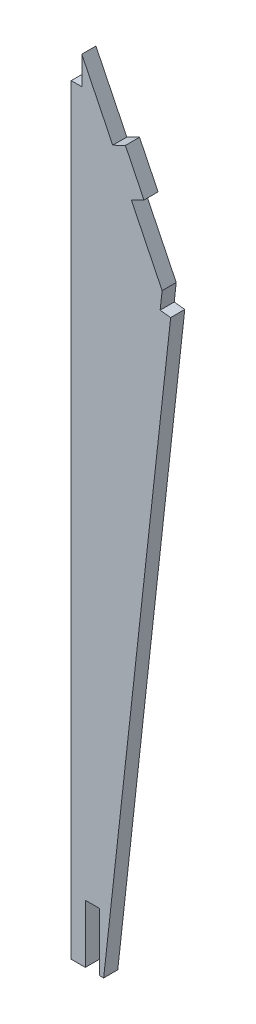
ISO-10303-21;
HEADER;
FILE_DESCRIPTION(('STEP AP214'),'2;1');
FILE_NAME('part.step','',(''),(''),'','','');
FILE_SCHEMA(('AUTOMOTIVE_DESIGN { 1 0 10303 214 1 1 1 1 }'));
ENDSEC;
DATA;
#1=APPLICATION_CONTEXT('core data for automotive mechanical design processes');
#2=APPLICATION_PROTOCOL_DEFINITION('international standard','automotive_design',2000,#1);
#3=PRODUCT_CONTEXT('',#1,'mechanical');
#4=PRODUCT('Part','Part','',(#3));
#5=PRODUCT_RELATED_PRODUCT_CATEGORY('part','',(#4));
#6=PRODUCT_DEFINITION_FORMATION('','',#4);
#7=PRODUCT_DEFINITION_CONTEXT('part definition',#1,'design');
#8=PRODUCT_DEFINITION('design','',#6,#7);
#9=PRODUCT_DEFINITION_SHAPE('','',#8);
#10=(LENGTH_UNIT() NAMED_UNIT(*) SI_UNIT(.MILLI.,.METRE.));
#11=(NAMED_UNIT(*) PLANE_ANGLE_UNIT() SI_UNIT($,.RADIAN.));
#12=(NAMED_UNIT(*) SI_UNIT($,.STERADIAN.) SOLID_ANGLE_UNIT());
#13=UNCERTAINTY_MEASURE_WITH_UNIT(LENGTH_MEASURE(1.E-05),#10,'distance_accuracy_value','');
#14=(GEOMETRIC_REPRESENTATION_CONTEXT(3) GLOBAL_UNCERTAINTY_ASSIGNED_CONTEXT((#13)) GLOBAL_UNIT_ASSIGNED_CONTEXT((#10,
#11,#12)) REPRESENTATION_CONTEXT('',''));
#15=CARTESIAN_POINT('',(0.,0.,0.));
#16=DIRECTION('',(0.,0.,1.));
#17=DIRECTION('',(1.,0.,0.));
#18=AXIS2_PLACEMENT_3D('',#15,#16,#17);
#19=CARTESIAN_POINT('',(10.822892068358,97.79495465443,2.));
#20=DIRECTION('',(0.10999766931796,0.993931845120487,0.));
#21=DIRECTION('',(-0.993931845120487,0.10999766931796,0.));
#22=AXIS2_PLACEMENT_3D('',#19,#20,#21);
#23=PLANE('',#22);
#24=DIRECTION('',(0.993931845120487,-0.10999766931796,0.));
#25=VECTOR('',#24,1.);
#26=CARTESIAN_POINT('',(10.822892068358,97.79495465443,0.));
#27=LINE('',#26,#25);
#28=CARTESIAN_POINT('',(26.0623496860735,96.1084156549523,0.));
#29=VERTEX_POINT('',#28);
#30=CARTESIAN_POINT('',(27.553247453754,95.9434191509754,0.));
#31=VERTEX_POINT('',#30);
#32=EDGE_CURVE('E178',#29,#31,#27,.T.);
#33=ORIENTED_EDGE('',*,*,#32,.F.);
#34=DIRECTION('',(0.,0.,-1.));
#35=VECTOR('',#34,1.);
#36=CARTESIAN_POINT('',(26.0623496860735,96.1084156549523,2.));
#37=LINE('',#36,#35);
#38=CARTESIAN_POINT('',(26.0623496860735,96.1084156549523,2.));
#39=VERTEX_POINT('',#38);
#40=EDGE_CURVE('E11',#39,#29,#37,.T.);
#41=ORIENTED_EDGE('',*,*,#40,.F.);
#42=DIRECTION('',(0.993931845120487,-0.10999766931796,0.));
#43=VECTOR('',#42,1.);
#44=CARTESIAN_POINT('',(10.822892068358,97.79495465443,2.));
#45=LINE('',#44,#43);
#46=CARTESIAN_POINT('',(27.553247453754,95.9434191509754,2.));
#47=VERTEX_POINT('',#46);
#48=EDGE_CURVE('E216',#39,#47,#45,.T.);
#49=ORIENTED_EDGE('',*,*,#48,.T.);
#50=DIRECTION('',(0.,0.,-1.));
#51=VECTOR('',#50,1.);
#52=CARTESIAN_POINT('',(27.553247453754,95.9434191509754,2.));
#53=LINE('',#52,#51);
#54=EDGE_CURVE('E53',#47,#31,#53,.T.);
#55=ORIENTED_EDGE('',*,*,#54,.T.);
#56=EDGE_LOOP('',(#33,#41,#49,#55));
#57=FACE_BOUND('',#56,.T.);
#58=ADVANCED_FACE('F37',(#57),#23,.T.);
#59=CARTESIAN_POINT('',(15.2394576177052,-1.68653899947817,2.));
#60=DIRECTION('',(0.993931845120476,-0.109997669318064,0.));
#61=DIRECTION('',(0.109997669318064,0.993931845120476,0.));
#62=AXIS2_PLACEMENT_3D('',#59,#60,#61);
#63=PLANE('',#62);
#64=DIRECTION('',(-0.109997669318064,-0.993931845120476,0.));
#65=VECTOR('',#64,1.);
#66=CARTESIAN_POINT('',(15.2394576177052,-1.68653899947817,0.));
#67=LINE('',#66,#65);
#68=CARTESIAN_POINT('',(26.3429738691066,98.6441176726103,0.));
#69=VERTEX_POINT('',#68);
#70=EDGE_CURVE('E180',#69,#29,#67,.T.);
#71=ORIENTED_EDGE('',*,*,#70,.F.);
#72=DIRECTION('',(0.,0.,-1.));
#73=VECTOR('',#72,1.);
#74=CARTESIAN_POINT('',(26.3429738691066,98.6441176726103,2.));
#75=LINE('',#74,#73);
#76=CARTESIAN_POINT('',(26.3429738691066,98.6441176726103,2.));
#77=VERTEX_POINT('',#76);
#78=EDGE_CURVE('E45',#77,#69,#75,.T.);
#79=ORIENTED_EDGE('',*,*,#78,.F.);
#80=DIRECTION('',(-0.109997669318064,-0.993931845120476,0.));
#81=VECTOR('',#80,1.);
#82=CARTESIAN_POINT('',(15.2394576177052,-1.68653899947817,2.));
#83=LINE('',#82,#81);
#84=EDGE_CURVE('E266',#77,#39,#83,.T.);
#85=ORIENTED_EDGE('',*,*,#84,.T.);
#86=ORIENTED_EDGE('',*,*,#40,.T.);
#87=EDGE_LOOP('',(#71,#79,#85,#86));
#88=FACE_BOUND('',#87,.T.);
#89=ADVANCED_FACE('F254',(#88),#63,.T.);
#90=CARTESIAN_POINT('',(60.1469767659438,29.3356406724625,2.));
#91=DIRECTION('',(0.898794046299179,0.438371146789053,0.));
#92=DIRECTION('',(-0.438371146789053,0.898794046299179,0.));
#93=AXIS2_PLACEMENT_3D('',#90,#91,#92);
#94=PLANE('',#93);
#95=DIRECTION('',(0.438371146789053,-0.898794046299179,0.));
#96=VECTOR('',#95,1.);
#97=CARTESIAN_POINT('',(60.1469767659438,29.3356406724625,0.));
#98=LINE('',#97,#96);
#99=CARTESIAN_POINT('',(21.972547422718,107.604819804981,0.));
#100=VERTEX_POINT('',#99);
#101=EDGE_CURVE('E183',#100,#69,#98,.T.);
#102=ORIENTED_EDGE('',*,*,#101,.F.);
#103=DIRECTION('',(0.,0.,-1.));
#104=VECTOR('',#103,1.);
#105=CARTESIAN_POINT('',(21.972547422718,107.604819804981,2.));
#106=LINE('',#105,#104);
#107=CARTESIAN_POINT('',(21.972547422718,107.604819804981,2.));
#108=VERTEX_POINT('',#107);
#109=EDGE_CURVE('E243',#108,#100,#106,.T.);
#110=ORIENTED_EDGE('',*,*,#109,.F.);
#111=DIRECTION('',(0.438371146789053,-0.898794046299179,0.));
#112=VECTOR('',#111,1.);
#113=CARTESIAN_POINT('',(60.1469767659438,29.3356406724625,2.));
#114=LINE('',#113,#112);
#115=EDGE_CURVE('E250',#108,#77,#114,.T.);
#116=ORIENTED_EDGE('',*,*,#115,.T.);
#117=ORIENTED_EDGE('',*,*,#78,.T.);
#118=EDGE_LOOP('',(#102,#110,#116,#117));
#119=FACE_BOUND('',#118,.T.);
#120=ADVANCED_FACE('F248',(#119),#94,.T.);
#121=CARTESIAN_POINT('',(-38.1744293432189,78.2691791325325,2.));
#122=DIRECTION('',(0.438371146788926,-0.898794046299241,0.));
#123=DIRECTION('',(0.898794046299241,0.438371146788927,0.));
#124=AXIS2_PLACEMENT_3D('',#121,#122,#123);
#125=PLANE('',#124);
#126=DIRECTION('',(-0.898794046299241,-0.438371146788927,0.));
#127=VECTOR('',#126,1.);
#128=CARTESIAN_POINT('',(-38.1744293432189,78.2691791325325,0.));
#129=LINE('',#128,#127);
#130=CARTESIAN_POINT('',(23.7701355153167,108.481562098559,0.));
#131=VERTEX_POINT('',#130);
#132=EDGE_CURVE('E186',#131,#100,#129,.T.);
#133=ORIENTED_EDGE('',*,*,#132,.F.);
#134=DIRECTION('',(0.,0.,-1.));
#135=VECTOR('',#134,1.);
#136=CARTESIAN_POINT('',(23.7701355153167,108.481562098559,2.));
#137=LINE('',#136,#135);
#138=CARTESIAN_POINT('',(23.7701355153167,108.481562098559,2.));
#139=VERTEX_POINT('',#138);
#140=EDGE_CURVE('E241',#139,#131,#137,.T.);
#141=ORIENTED_EDGE('',*,*,#140,.F.);
#142=DIRECTION('',(-0.898794046299241,-0.438371146788927,0.));
#143=VECTOR('',#142,1.);
#144=CARTESIAN_POINT('',(-38.1744293432189,78.2691791325325,2.));
#145=LINE('',#144,#143);
#146=EDGE_CURVE('E263',#139,#108,#145,.T.);
#147=ORIENTED_EDGE('',*,*,#146,.T.);
#148=ORIENTED_EDGE('',*,*,#109,.T.);
#149=EDGE_LOOP('',(#133,#141,#147,#148));
#150=FACE_BOUND('',#149,.T.);
#151=ADVANCED_FACE('F260',(#150),#125,.T.);
#152=CARTESIAN_POINT('',(61.9445648585684,30.2123829660949,2.));
#153=DIRECTION('',(0.898794046298942,0.438371146789539,0.));
#154=DIRECTION('',(-0.438371146789539,0.898794046298942,0.));
#155=AXIS2_PLACEMENT_3D('',#152,#153,#154);
#156=PLANE('',#155);
#157=DIRECTION('',(0.438371146789539,-0.898794046298942,0.));
#158=VECTOR('',#157,1.);
#159=CARTESIAN_POINT('',(61.9445648585684,30.2123829660949,0.));
#160=LINE('',#159,#158);
#161=CARTESIAN_POINT('',(21.1399086345791,113.874326376354,0.));
#162=VERTEX_POINT('',#161);
#163=EDGE_CURVE('E189',#162,#131,#160,.T.);
#164=ORIENTED_EDGE('',*,*,#163,.F.);
#165=DIRECTION('',(0.,0.,-1.));
#166=VECTOR('',#165,1.);
#167=CARTESIAN_POINT('',(21.1399086345791,113.874326376354,2.));
#168=LINE('',#167,#166);
#169=CARTESIAN_POINT('',(21.1399086345791,113.874326376354,2.));
#170=VERTEX_POINT('',#169);
#171=EDGE_CURVE('E239',#170,#162,#168,.T.);
#172=ORIENTED_EDGE('',*,*,#171,.F.);
#173=DIRECTION('',(0.438371146789539,-0.898794046298942,0.));
#174=VECTOR('',#173,1.);
#175=CARTESIAN_POINT('',(61.9445648585684,30.2123829660949,2.));
#176=LINE('',#175,#174);
#177=EDGE_CURVE('E268',#170,#139,#176,.T.);
#178=ORIENTED_EDGE('',*,*,#177,.T.);
#179=ORIENTED_EDGE('',*,*,#140,.T.);
#180=EDGE_LOOP('',(#164,#172,#178,#179));
#181=FACE_BOUND('',#180,.T.);
#182=ADVANCED_FACE('F320',(#181),#156,.T.);
#183=CARTESIAN_POINT('',(-40.8046562239632,83.6619434103089,2.));
#184=DIRECTION('',(-0.4383711467891,0.898794046299156,0.));
#185=DIRECTION('',(-0.898794046299156,-0.4383711467891,0.));
#186=AXIS2_PLACEMENT_3D('',#183,#184,#185);
#187=PLANE('',#186);
#188=DIRECTION('',(0.898794046299156,0.4383711467891,0.));
#189=VECTOR('',#188,1.);
#190=CARTESIAN_POINT('',(-40.8046562239632,83.6619434103089,0.));
#191=LINE('',#190,#189);
#192=CARTESIAN_POINT('',(19.3423205419831,112.997584082777,0.));
#193=VERTEX_POINT('',#192);
#194=EDGE_CURVE('E192',#193,#162,#191,.T.);
#195=ORIENTED_EDGE('',*,*,#194,.F.);
#196=DIRECTION('',(0.,0.,-1.));
#197=VECTOR('',#196,1.);
#198=CARTESIAN_POINT('',(19.3423205419831,112.997584082777,2.));
#199=LINE('',#198,#197);
#200=CARTESIAN_POINT('',(19.3423205419831,112.997584082777,2.));
#201=VERTEX_POINT('',#200);
#202=EDGE_CURVE('E237',#201,#193,#199,.T.);
#203=ORIENTED_EDGE('',*,*,#202,.F.);
#204=DIRECTION('',(0.898794046299156,0.4383711467891,0.));
#205=VECTOR('',#204,1.);
#206=CARTESIAN_POINT('',(-40.8046562239632,83.6619434103089,2.));
#207=LINE('',#206,#205);
#208=EDGE_CURVE('E274',#201,#170,#207,.T.);
#209=ORIENTED_EDGE('',*,*,#208,.T.);
#210=ORIENTED_EDGE('',*,*,#171,.T.);
#211=EDGE_LOOP('',(#195,#203,#209,#210));
#212=FACE_BOUND('',#211,.T.);
#213=ADVANCED_FACE('F323',(#212),#187,.T.);
#214=CARTESIAN_POINT('',(60.1469767659448,29.3356406724649,2.));
#215=DIRECTION('',(0.898794046299168,0.438371146789076,0.));
#216=DIRECTION('',(-0.438371146789076,0.898794046299168,0.));
#217=AXIS2_PLACEMENT_3D('',#214,#215,#216);
#218=PLANE('',#217);
#219=DIRECTION('',(0.438371146789076,-0.898794046299168,0.));
#220=VECTOR('',#219,1.);
#221=CARTESIAN_POINT('',(60.1469767659448,29.3356406724649,0.));
#222=LINE('',#221,#220);
#223=CARTESIAN_POINT('',(14.9586090740922,121.985524545768,0.));
#224=VERTEX_POINT('',#223);
#225=EDGE_CURVE('E195',#224,#193,#222,.T.);
#226=ORIENTED_EDGE('',*,*,#225,.F.);
#227=DIRECTION('',(0.,0.,-1.));
#228=VECTOR('',#227,1.);
#229=CARTESIAN_POINT('',(14.9586090740922,121.985524545768,2.));
#230=LINE('',#229,#228);
#231=CARTESIAN_POINT('',(14.9586090740922,121.985524545768,2.));
#232=VERTEX_POINT('',#231);
#233=EDGE_CURVE('E235',#232,#224,#230,.T.);
#234=ORIENTED_EDGE('',*,*,#233,.F.);
#235=DIRECTION('',(0.438371146789076,-0.898794046299168,0.));
#236=VECTOR('',#235,1.);
#237=CARTESIAN_POINT('',(60.1469767659448,29.3356406724649,2.));
#238=LINE('',#237,#236);
#239=EDGE_CURVE('E277',#232,#201,#238,.T.);
#240=ORIENTED_EDGE('',*,*,#239,.T.);
#241=ORIENTED_EDGE('',*,*,#202,.T.);
#242=EDGE_LOOP('',(#226,#234,#240,#241));
#243=FACE_BOUND('',#242,.T.);
#244=ADVANCED_FACE('F327',(#243),#218,.T.);
#245=CARTESIAN_POINT('',(14.9586090740922,0.,2.));
#246=DIRECTION('',(1.,0.,0.));
#247=DIRECTION('',(0.,0.,-1.));
#248=AXIS2_PLACEMENT_3D('',#245,#246,#247);
#249=PLANE('',#248);
#250=DIRECTION('',(0.,-1.,0.));
#251=VECTOR('',#250,1.);
#252=CARTESIAN_POINT('',(14.9586090740922,0.,0.));
#253=LINE('',#252,#251);
#254=CARTESIAN_POINT('',(14.9586090740922,117.985524545768,0.));
#255=VERTEX_POINT('',#254);
#256=EDGE_CURVE('E198',#224,#255,#253,.T.);
#257=ORIENTED_EDGE('',*,*,#256,.T.);
#258=DIRECTION('',(0.,0.,-1.));
#259=VECTOR('',#258,1.);
#260=CARTESIAN_POINT('',(14.9586090740922,117.985524545768,2.));
#261=LINE('',#260,#259);
#262=CARTESIAN_POINT('',(14.9586090740922,117.985524545768,2.));
#263=VERTEX_POINT('',#262);
#264=EDGE_CURVE('E232',#263,#255,#261,.T.);
#265=ORIENTED_EDGE('',*,*,#264,.F.);
#266=DIRECTION('',(0.,-1.,0.));
#267=VECTOR('',#266,1.);
#268=CARTESIAN_POINT('',(14.9586090740922,0.,2.));
#269=LINE('',#268,#267);
#270=EDGE_CURVE('E280',#232,#263,#269,.T.);
#271=ORIENTED_EDGE('',*,*,#270,.F.);
#272=ORIENTED_EDGE('',*,*,#233,.T.);
#273=EDGE_LOOP('',(#257,#265,#271,#272));
#274=FACE_BOUND('',#273,.T.);
#275=ADVANCED_FACE('F331',(#274),#249,.F.);
#276=CARTESIAN_POINT('',(0.,117.985524545768,2.));
#277=DIRECTION('',(0.,-1.,0.));
#278=DIRECTION('',(0.,0.,-1.));
#279=AXIS2_PLACEMENT_3D('',#276,#277,#278);
#280=PLANE('',#279);
#281=DIRECTION('',(-1.,0.,0.));
#282=VECTOR('',#281,1.);
#283=CARTESIAN_POINT('',(0.,117.985524545768,0.));
#284=LINE('',#283,#282);
#285=CARTESIAN_POINT('',(13.4586090740922,117.985524545768,0.));
#286=VERTEX_POINT('',#285);
#287=EDGE_CURVE('E200',#255,#286,#284,.T.);
#288=ORIENTED_EDGE('',*,*,#287,.T.);
#289=DIRECTION('',(0.,0.,-1.));
#290=VECTOR('',#289,1.);
#291=CARTESIAN_POINT('',(13.4586090740922,117.985524545768,2.));
#292=LINE('',#291,#290);
#293=CARTESIAN_POINT('',(13.4586090740922,117.985524545768,2.));
#294=VERTEX_POINT('',#293);
#295=EDGE_CURVE('E229',#294,#286,#292,.T.);
#296=ORIENTED_EDGE('',*,*,#295,.F.);
#297=DIRECTION('',(-1.,0.,0.));
#298=VECTOR('',#297,1.);
#299=CARTESIAN_POINT('',(0.,117.985524545768,2.));
#300=LINE('',#299,#298);
#301=EDGE_CURVE('E282',#263,#294,#300,.T.);
#302=ORIENTED_EDGE('',*,*,#301,.F.);
#303=ORIENTED_EDGE('',*,*,#264,.T.);
#304=EDGE_LOOP('',(#288,#296,#302,#303));
#305=FACE_BOUND('',#304,.T.);
#306=ADVANCED_FACE('F335',(#305),#280,.F.);
#307=CARTESIAN_POINT('',(13.4586090740922,0.,2.));
#308=DIRECTION('',(1.,0.,0.));
#309=DIRECTION('',(0.,0.,-1.));
#310=AXIS2_PLACEMENT_3D('',#307,#308,#309);
#311=PLANE('',#310);
#312=DIRECTION('',(0.,-1.,0.));
#313=VECTOR('',#312,1.);
#314=CARTESIAN_POINT('',(13.4586090740922,0.,0.));
#315=LINE('',#314,#313);
#316=CARTESIAN_POINT('',(13.4586090740922,10.1155704253802,0.));
#317=VERTEX_POINT('',#316);
#318=EDGE_CURVE('E202',#286,#317,#315,.T.);
#319=ORIENTED_EDGE('',*,*,#318,.T.);
#320=DIRECTION('',(0.,0.,-1.));
#321=VECTOR('',#320,1.);
#322=CARTESIAN_POINT('',(13.4586090740922,10.1155704253802,2.));
#323=LINE('',#322,#321);
#324=CARTESIAN_POINT('',(13.4586090740922,10.1155704253802,2.));
#325=VERTEX_POINT('',#324);
#326=EDGE_CURVE('E226',#325,#317,#323,.T.);
#327=ORIENTED_EDGE('',*,*,#326,.F.);
#328=DIRECTION('',(0.,-1.,0.));
#329=VECTOR('',#328,1.);
#330=CARTESIAN_POINT('',(13.4586090740922,0.,2.));
#331=LINE('',#330,#329);
#332=EDGE_CURVE('E284',#294,#325,#331,.T.);
#333=ORIENTED_EDGE('',*,*,#332,.F.);
#334=ORIENTED_EDGE('',*,*,#295,.T.);
#335=EDGE_LOOP('',(#319,#327,#333,#334));
#336=FACE_BOUND('',#335,.T.);
#337=ADVANCED_FACE('F339',(#336),#311,.F.);
#338=CARTESIAN_POINT('',(0.,10.1155704253802,2.));
#339=DIRECTION('',(0.,1.,0.));
#340=DIRECTION('',(0.,0.,1.));
#341=AXIS2_PLACEMENT_3D('',#338,#339,#340);
#342=PLANE('',#341);
#343=DIRECTION('',(1.,0.,0.));
#344=VECTOR('',#343,1.);
#345=CARTESIAN_POINT('',(0.,10.1155704253802,0.));
#346=LINE('',#345,#344);
#347=CARTESIAN_POINT('',(15.4586090740931,10.1155704253802,0.));
#348=VERTEX_POINT('',#347);
#349=EDGE_CURVE('E204',#317,#348,#346,.T.);
#350=ORIENTED_EDGE('',*,*,#349,.T.);
#351=DIRECTION('',(0.,0.,-1.));
#352=VECTOR('',#351,1.);
#353=CARTESIAN_POINT('',(15.4586090740931,10.1155704253802,2.));
#354=LINE('',#353,#352);
#355=CARTESIAN_POINT('',(15.4586090740931,10.1155704253802,2.));
#356=VERTEX_POINT('',#355);
#357=EDGE_CURVE('E223',#356,#348,#354,.T.);
#358=ORIENTED_EDGE('',*,*,#357,.F.);
#359=DIRECTION('',(1.,0.,0.));
#360=VECTOR('',#359,1.);
#361=CARTESIAN_POINT('',(0.,10.1155704253802,2.));
#362=LINE('',#361,#360);
#363=EDGE_CURVE('E286',#325,#356,#362,.T.);
#364=ORIENTED_EDGE('',*,*,#363,.F.);
#365=ORIENTED_EDGE('',*,*,#326,.T.);
#366=EDGE_LOOP('',(#350,#358,#364,#365));
#367=FACE_BOUND('',#366,.T.);
#368=ADVANCED_FACE('F343',(#367),#342,.F.);
#369=CARTESIAN_POINT('',(15.4586090740931,0.,2.));
#370=DIRECTION('',(-1.,0.,0.));
#371=DIRECTION('',(0.,0.,1.));
#372=AXIS2_PLACEMENT_3D('',#369,#370,#371);
#373=PLANE('',#372);
#374=DIRECTION('',(0.,1.,0.));
#375=VECTOR('',#374,1.);
#376=CARTESIAN_POINT('',(15.4586090740931,0.,0.));
#377=LINE('',#376,#375);
#378=CARTESIAN_POINT('',(15.4586090740931,18.3655704253911,0.));
#379=VERTEX_POINT('',#378);
#380=EDGE_CURVE('E206',#348,#379,#377,.T.);
#381=ORIENTED_EDGE('',*,*,#380,.T.);
#382=DIRECTION('',(0.,0.,-1.));
#383=VECTOR('',#382,1.);
#384=CARTESIAN_POINT('',(15.4586090740931,18.3655704253911,2.));
#385=LINE('',#384,#383);
#386=CARTESIAN_POINT('',(15.4586090740931,18.3655704253911,2.));
#387=VERTEX_POINT('',#386);
#388=EDGE_CURVE('E220',#387,#379,#385,.T.);
#389=ORIENTED_EDGE('',*,*,#388,.F.);
#390=DIRECTION('',(0.,1.,0.));
#391=VECTOR('',#390,1.);
#392=CARTESIAN_POINT('',(15.4586090740931,0.,2.));
#393=LINE('',#392,#391);
#394=EDGE_CURVE('E288',#356,#387,#393,.T.);
#395=ORIENTED_EDGE('',*,*,#394,.F.);
#396=ORIENTED_EDGE('',*,*,#357,.T.);
#397=EDGE_LOOP('',(#381,#389,#395,#396));
#398=FACE_BOUND('',#397,.T.);
#399=ADVANCED_FACE('F294',(#398),#373,.F.);
#400=CARTESIAN_POINT('',(0.,18.3655704253911,2.));
#401=DIRECTION('',(0.,1.,0.));
#402=DIRECTION('',(0.,0.,1.));
#403=AXIS2_PLACEMENT_3D('',#400,#401,#402);
#404=PLANE('',#403);
#405=DIRECTION('',(1.,0.,0.));
#406=VECTOR('',#405,1.);
#407=CARTESIAN_POINT('',(0.,18.3655704253911,0.));
#408=LINE('',#407,#406);
#409=CARTESIAN_POINT('',(17.4586090740931,18.3655704253911,0.));
#410=VERTEX_POINT('',#409);
#411=EDGE_CURVE('E208',#379,#410,#408,.T.);
#412=ORIENTED_EDGE('',*,*,#411,.T.);
#413=DIRECTION('',(0.,0.,-1.));
#414=VECTOR('',#413,1.);
#415=CARTESIAN_POINT('',(17.4586090740931,18.3655704253911,2.));
#416=LINE('',#415,#414);
#417=CARTESIAN_POINT('',(17.4586090740931,18.3655704253911,2.));
#418=VERTEX_POINT('',#417);
#419=EDGE_CURVE('E170',#418,#410,#416,.T.);
#420=ORIENTED_EDGE('',*,*,#419,.F.);
#421=DIRECTION('',(1.,0.,0.));
#422=VECTOR('',#421,1.);
#423=CARTESIAN_POINT('',(0.,18.3655704253911,2.));
#424=LINE('',#423,#422);
#425=EDGE_CURVE('E158',#387,#418,#424,.T.);
#426=ORIENTED_EDGE('',*,*,#425,.F.);
#427=ORIENTED_EDGE('',*,*,#388,.T.);
#428=EDGE_LOOP('',(#412,#420,#426,#427));
#429=FACE_BOUND('',#428,.T.);
#430=ADVANCED_FACE('F298',(#429),#404,.F.);
#431=CARTESIAN_POINT('',(17.4586090740931,0.,2.));
#432=DIRECTION('',(1.,0.,0.));
#433=DIRECTION('',(0.,0.,-1.));
#434=AXIS2_PLACEMENT_3D('',#431,#432,#433);
#435=PLANE('',#434);
#436=DIRECTION('',(0.,-1.,0.));
#437=VECTOR('',#436,1.);
#438=CARTESIAN_POINT('',(17.4586090740931,0.,0.));
#439=LINE('',#438,#437);
#440=CARTESIAN_POINT('',(17.4586090740931,10.1155704253797,0.));
#441=VERTEX_POINT('',#440);
#442=EDGE_CURVE('E167',#410,#441,#439,.T.);
#443=ORIENTED_EDGE('',*,*,#442,.T.);
#444=DIRECTION('',(0.,0.,-1.));
#445=VECTOR('',#444,1.);
#446=CARTESIAN_POINT('',(17.4586090740931,10.1155704253797,2.));
#447=LINE('',#446,#445);
#448=CARTESIAN_POINT('',(17.4586090740931,10.1155704253797,2.));
#449=VERTEX_POINT('',#448);
#450=EDGE_CURVE('E164',#449,#441,#447,.T.);
#451=ORIENTED_EDGE('',*,*,#450,.F.);
#452=DIRECTION('',(0.,-1.,0.));
#453=VECTOR('',#452,1.);
#454=CARTESIAN_POINT('',(17.4586090740931,0.,2.));
#455=LINE('',#454,#453);
#456=EDGE_CURVE('E151',#418,#449,#455,.T.);
#457=ORIENTED_EDGE('',*,*,#456,.F.);
#458=ORIENTED_EDGE('',*,*,#419,.T.);
#459=EDGE_LOOP('',(#443,#451,#457,#458));
#460=FACE_BOUND('',#459,.T.);
#461=ADVANCED_FACE('F165',(#460),#435,.F.);
#462=CARTESIAN_POINT('',(0.,10.1155704253797,2.));
#463=DIRECTION('',(0.,1.,0.));
#464=DIRECTION('',(0.,0.,1.));
#465=AXIS2_PLACEMENT_3D('',#462,#463,#464);
#466=PLANE('',#465);
#467=DIRECTION('',(1.,0.,0.));
#468=VECTOR('',#467,1.);
#469=CARTESIAN_POINT('',(0.,10.1155704253797,0.));
#470=LINE('',#469,#468);
#471=CARTESIAN_POINT('',(18.0547457519087,10.1155704253797,0.));
#472=VERTEX_POINT('',#471);
#473=EDGE_CURVE('E211',#441,#472,#470,.T.);
#474=ORIENTED_EDGE('',*,*,#473,.T.);
#475=DIRECTION('',(0.,0.,-1.));
#476=VECTOR('',#475,1.);
#477=CARTESIAN_POINT('',(18.0547457519087,10.1155704253797,2.));
#478=LINE('',#477,#476);
#479=CARTESIAN_POINT('',(18.0547457519087,10.1155704253797,2.));
#480=VERTEX_POINT('',#479);
#481=EDGE_CURVE('E103',#480,#472,#478,.T.);
#482=ORIENTED_EDGE('',*,*,#481,.F.);
#483=DIRECTION('',(1.,0.,0.));
#484=VECTOR('',#483,1.);
#485=CARTESIAN_POINT('',(0.,10.1155704253797,2.));
#486=LINE('',#485,#484);
#487=EDGE_CURVE('E156',#449,#480,#486,.T.);
#488=ORIENTED_EDGE('',*,*,#487,.F.);
#489=ORIENTED_EDGE('',*,*,#450,.T.);
#490=EDGE_LOOP('',(#474,#482,#488,#489));
#491=FACE_BOUND('',#490,.T.);
#492=ADVANCED_FACE('F172',(#491),#466,.F.);
#493=CARTESIAN_POINT('',(16.7303553853901,-1.85153550345498,2.));
#494=DIRECTION('',(0.993931845120481,-0.10999766931802,0.));
#495=DIRECTION('',(0.10999766931802,0.993931845120481,0.));
#496=AXIS2_PLACEMENT_3D('',#493,#494,#495);
#497=PLANE('',#496);
#498=DIRECTION('',(-0.10999766931802,-0.993931845120481,0.));
#499=VECTOR('',#498,1.);
#500=CARTESIAN_POINT('',(16.7303553853901,-1.85153550345498,0.));
#501=LINE('',#500,#499);
#502=EDGE_CURVE('E213',#31,#472,#501,.T.);
#503=ORIENTED_EDGE('',*,*,#502,.F.);
#504=ORIENTED_EDGE('',*,*,#54,.F.);
#505=DIRECTION('',(-0.10999766931802,-0.993931845120481,0.));
#506=VECTOR('',#505,1.);
#507=CARTESIAN_POINT('',(16.7303553853901,-1.85153550345498,2.));
#508=LINE('',#507,#506);
#509=EDGE_CURVE('E173',#47,#480,#508,.T.);
#510=ORIENTED_EDGE('',*,*,#509,.T.);
#511=ORIENTED_EDGE('',*,*,#481,.T.);
#512=EDGE_LOOP('',(#503,#504,#510,#511));
#513=FACE_BOUND('',#512,.T.);
#514=ADVANCED_FACE('F299',(#513),#497,.T.);
#515=CARTESIAN_POINT('',(0.,0.,2.));
#516=DIRECTION('',(0.,0.,1.));
#517=DIRECTION('',(1.,0.,0.));
#518=AXIS2_PLACEMENT_3D('',#515,#516,#517);
#519=PLANE('',#518);
#520=ORIENTED_EDGE('',*,*,#48,.F.);
#521=ORIENTED_EDGE('',*,*,#84,.F.);
#522=ORIENTED_EDGE('',*,*,#115,.F.);
#523=ORIENTED_EDGE('',*,*,#146,.F.);
#524=ORIENTED_EDGE('',*,*,#177,.F.);
#525=ORIENTED_EDGE('',*,*,#208,.F.);
#526=ORIENTED_EDGE('',*,*,#239,.F.);
#527=ORIENTED_EDGE('',*,*,#270,.T.);
#528=ORIENTED_EDGE('',*,*,#301,.T.);
#529=ORIENTED_EDGE('',*,*,#332,.T.);
#530=ORIENTED_EDGE('',*,*,#363,.T.);
#531=ORIENTED_EDGE('',*,*,#394,.T.);
#532=ORIENTED_EDGE('',*,*,#425,.T.);
#533=ORIENTED_EDGE('',*,*,#456,.T.);
#534=ORIENTED_EDGE('',*,*,#487,.T.);
#535=ORIENTED_EDGE('',*,*,#509,.F.);
#536=EDGE_LOOP('',(#520,#521,#522,#523,#524,#525,#526,#527,#528,#529,#530,#531,#532,#533,#534,#535));
#537=FACE_BOUND('',#536,.T.);
#538=ADVANCED_FACE('F153',(#537),#519,.T.);
#539=CARTESIAN_POINT('',(0.,0.,0.));
#540=DIRECTION('',(0.,0.,1.));
#541=DIRECTION('',(1.,0.,0.));
#542=AXIS2_PLACEMENT_3D('',#539,#540,#541);
#543=PLANE('',#542);
#544=ORIENTED_EDGE('',*,*,#32,.T.);
#545=ORIENTED_EDGE('',*,*,#502,.T.);
#546=ORIENTED_EDGE('',*,*,#473,.F.);
#547=ORIENTED_EDGE('',*,*,#442,.F.);
#548=ORIENTED_EDGE('',*,*,#411,.F.);
#549=ORIENTED_EDGE('',*,*,#380,.F.);
#550=ORIENTED_EDGE('',*,*,#349,.F.);
#551=ORIENTED_EDGE('',*,*,#318,.F.);
#552=ORIENTED_EDGE('',*,*,#287,.F.);
#553=ORIENTED_EDGE('',*,*,#256,.F.);
#554=ORIENTED_EDGE('',*,*,#225,.T.);
#555=ORIENTED_EDGE('',*,*,#194,.T.);
#556=ORIENTED_EDGE('',*,*,#163,.T.);
#557=ORIENTED_EDGE('',*,*,#132,.T.);
#558=ORIENTED_EDGE('',*,*,#101,.T.);
#559=ORIENTED_EDGE('',*,*,#70,.T.);
#560=EDGE_LOOP('',(#544,#545,#546,#547,#548,#549,#550,#551,#552,#553,#554,#555,#556,#557,#558,#559));
#561=FACE_BOUND('',#560,.T.);
#562=ADVANCED_FACE('F256',(#561),#543,.F.);
#563=CLOSED_SHELL('',(#58,#89,#120,#151,#182,#213,#244,#275,#306,#337,#368,#399,#430,#461,#492,
#514,#538,#562));
#564=MANIFOLD_SOLID_BREP('B2',#563);
#565=ADVANCED_BREP_SHAPE_REPRESENTATION('',(#18,#564),#14);
#566=SHAPE_DEFINITION_REPRESENTATION(#9,#565);
ENDSEC;
END-ISO-10303-21;
